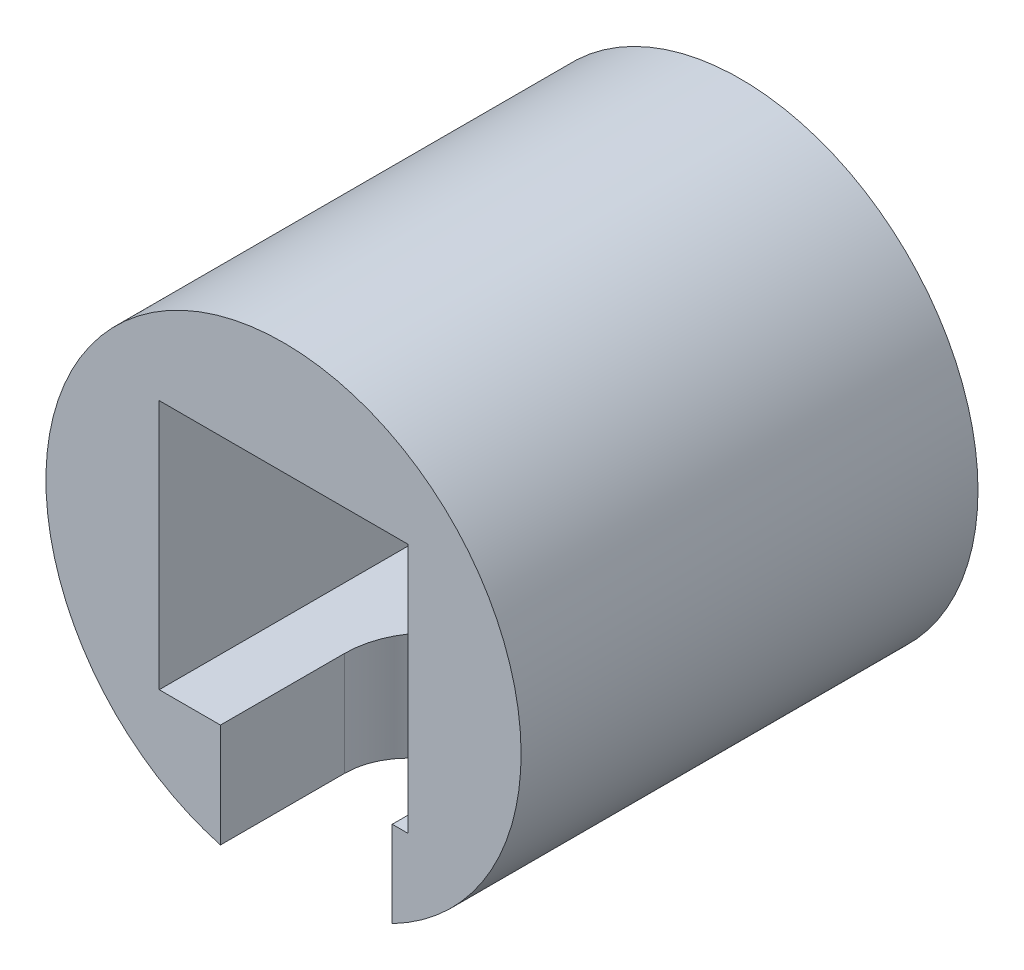
ISO-10303-21;
HEADER;
FILE_DESCRIPTION(('STEP AP214'),'2;1');
FILE_NAME('part.step','',(''),(''),'','','');
FILE_SCHEMA(('AUTOMOTIVE_DESIGN { 1 0 10303 214 1 1 1 1 }'));
ENDSEC;
DATA;
#1=APPLICATION_CONTEXT('core data for automotive mechanical design processes');
#2=APPLICATION_PROTOCOL_DEFINITION('international standard','automotive_design',2000,#1);
#3=PRODUCT_CONTEXT('',#1,'mechanical');
#4=PRODUCT('Part','Part','',(#3));
#5=PRODUCT_RELATED_PRODUCT_CATEGORY('part','',(#4));
#6=PRODUCT_DEFINITION_FORMATION('','',#4);
#7=PRODUCT_DEFINITION_CONTEXT('part definition',#1,'design');
#8=PRODUCT_DEFINITION('design','',#6,#7);
#9=PRODUCT_DEFINITION_SHAPE('','',#8);
#10=(LENGTH_UNIT() NAMED_UNIT(*) SI_UNIT(.MILLI.,.METRE.));
#11=(NAMED_UNIT(*) PLANE_ANGLE_UNIT() SI_UNIT($,.RADIAN.));
#12=(NAMED_UNIT(*) SI_UNIT($,.STERADIAN.) SOLID_ANGLE_UNIT());
#13=UNCERTAINTY_MEASURE_WITH_UNIT(LENGTH_MEASURE(1.E-05),#10,'distance_accuracy_value','');
#14=(GEOMETRIC_REPRESENTATION_CONTEXT(3) GLOBAL_UNCERTAINTY_ASSIGNED_CONTEXT((#13)) GLOBAL_UNIT_ASSIGNED_CONTEXT((#10,
#11,#12)) REPRESENTATION_CONTEXT('',''));
#15=CARTESIAN_POINT('',(0.,0.,0.));
#16=DIRECTION('',(0.,0.,1.));
#17=DIRECTION('',(1.,0.,0.));
#18=AXIS2_PLACEMENT_3D('',#15,#16,#17);
#19=CARTESIAN_POINT('',(0.,0.,25.));
#20=DIRECTION('',(0.,0.,1.));
#21=DIRECTION('',(1.,0.,0.));
#22=AXIS2_PLACEMENT_3D('',#19,#20,#21);
#23=PLANE('',#22);
#24=DIRECTION('',(0.,1.,0.));
#25=VECTOR('',#24,1.);
#26=CARTESIAN_POINT('',(5.94999999999998,-13.001,25.));
#27=LINE('',#26,#25);
#28=CARTESIAN_POINT('',(5.94999999999998,-11.5584384758496,25.));
#29=VERTEX_POINT('',#28);
#30=CARTESIAN_POINT('',(5.94999999999998,-6.85,25.));
#31=VERTEX_POINT('',#30);
#32=EDGE_CURVE('E116',#29,#31,#27,.T.);
#33=ORIENTED_EDGE('',*,*,#32,.F.);
#34=CARTESIAN_POINT('',(0.,0.,25.));
#35=DIRECTION('',(0.,0.,1.));
#36=DIRECTION('',(1.,0.,0.));
#37=AXIS2_PLACEMENT_3D('',#34,#35,#36);
#38=CIRCLE('',#37,13.);
#39=CARTESIAN_POINT('',(-3.45000000000002,-12.5338541558453,25.));
#40=VERTEX_POINT('',#39);
#41=EDGE_CURVE('E122',#29,#40,#38,.T.);
#42=ORIENTED_EDGE('',*,*,#41,.T.);
#43=DIRECTION('',(0.,1.,0.));
#44=VECTOR('',#43,1.);
#45=CARTESIAN_POINT('',(-3.45000000000002,-13.001,25.));
#46=LINE('',#45,#44);
#47=CARTESIAN_POINT('',(-3.45000000000002,-6.85,25.));
#48=VERTEX_POINT('',#47);
#49=EDGE_CURVE('E103',#40,#48,#46,.T.);
#50=ORIENTED_EDGE('',*,*,#49,.T.);
#51=DIRECTION('',(1.,0.,0.));
#52=VECTOR('',#51,1.);
#53=CARTESIAN_POINT('',(-6.8,-6.85,25.));
#54=LINE('',#53,#52);
#55=CARTESIAN_POINT('',(-6.8,-6.85,25.));
#56=VERTEX_POINT('',#55);
#57=EDGE_CURVE('E204',#56,#48,#54,.T.);
#58=ORIENTED_EDGE('',*,*,#57,.F.);
#59=DIRECTION('',(0.,1.,0.));
#60=VECTOR('',#59,1.);
#61=CARTESIAN_POINT('',(-6.8,-6.85,25.));
#62=LINE('',#61,#60);
#63=CARTESIAN_POINT('',(-6.8,6.85,25.));
#64=VERTEX_POINT('',#63);
#65=EDGE_CURVE('E230',#56,#64,#62,.T.);
#66=ORIENTED_EDGE('',*,*,#65,.T.);
#67=DIRECTION('',(1.,0.,0.));
#68=VECTOR('',#67,1.);
#69=CARTESIAN_POINT('',(-6.8,6.85,25.));
#70=LINE('',#69,#68);
#71=CARTESIAN_POINT('',(6.8,6.85,25.));
#72=VERTEX_POINT('',#71);
#73=EDGE_CURVE('E219',#64,#72,#70,.T.);
#74=ORIENTED_EDGE('',*,*,#73,.T.);
#75=DIRECTION('',(0.,1.,0.));
#76=VECTOR('',#75,1.);
#77=CARTESIAN_POINT('',(6.8,-6.85,25.));
#78=LINE('',#77,#76);
#79=CARTESIAN_POINT('',(6.8,-6.85,25.));
#80=VERTEX_POINT('',#79);
#81=EDGE_CURVE('E227',#80,#72,#78,.T.);
#82=ORIENTED_EDGE('',*,*,#81,.F.);
#83=EDGE_CURVE('E203',#31,#80,#54,.T.);
#84=ORIENTED_EDGE('',*,*,#83,.F.);
#85=EDGE_LOOP('',(#33,#42,#50,#58,#66,#74,#82,#84));
#86=FACE_BOUND('',#85,.T.);
#87=ADVANCED_FACE('F39',(#86),#23,.T.);
#88=CARTESIAN_POINT('',(0.,0.,0.));
#89=DIRECTION('',(0.,0.,1.));
#90=DIRECTION('',(1.,0.,0.));
#91=AXIS2_PLACEMENT_3D('',#88,#89,#90);
#92=PLANE('',#91);
#93=CARTESIAN_POINT('',(0.,0.,0.));
#94=DIRECTION('',(0.,0.,1.));
#95=DIRECTION('',(1.,0.,0.));
#96=AXIS2_PLACEMENT_3D('',#93,#94,#95);
#97=CIRCLE('',#96,13.);
#98=CARTESIAN_POINT('',(13.,0.,0.));
#99=VERTEX_POINT('',#98);
#100=EDGE_CURVE('E131',#99,#99,#97,.T.);
#101=ORIENTED_EDGE('',*,*,#100,.F.);
#102=EDGE_LOOP('',(#101));
#103=FACE_BOUND('',#102,.T.);
#104=CARTESIAN_POINT('',(0.,0.,0.));
#105=DIRECTION('',(0.,0.,1.));
#106=DIRECTION('',(1.,0.,0.));
#107=AXIS2_PLACEMENT_3D('',#104,#105,#106);
#108=CIRCLE('',#107,3.);
#109=CARTESIAN_POINT('',(3.,0.,0.));
#110=VERTEX_POINT('',#109);
#111=EDGE_CURVE('E137',#110,#110,#108,.T.);
#112=ORIENTED_EDGE('',*,*,#111,.T.);
#113=EDGE_LOOP('',(#112));
#114=FACE_BOUND('',#113,.T.);
#115=ADVANCED_FACE('F253',(#103,#114),#92,.F.);
#116=CARTESIAN_POINT('',(0.,0.,25.));
#117=DIRECTION('',(0.,0.,-1.));
#118=DIRECTION('',(-1.,0.,0.));
#119=AXIS2_PLACEMENT_3D('',#116,#117,#118);
#120=CYLINDRICAL_SURFACE('',#119,13.);
#121=ORIENTED_EDGE('',*,*,#41,.F.);
#122=DIRECTION('',(0.,0.,-1.));
#123=VECTOR('',#122,1.);
#124=CARTESIAN_POINT('',(5.94999999999998,-11.5584384758496,25.));
#125=LINE('',#124,#123);
#126=CARTESIAN_POINT('',(5.94999999999998,-11.5584384758496,18.2));
#127=VERTEX_POINT('',#126);
#128=EDGE_CURVE('E126',#127,#29,#125,.F.);
#129=ORIENTED_EDGE('',*,*,#128,.F.);
#130=CARTESIAN_POINT('',(-3.45000000000002,-12.5338541558453,18.2));
#131=CARTESIAN_POINT('',(-3.45001670615479,-12.5338338699505,18.0700170037956));
#132=CARTESIAN_POINT('',(-3.44460850980669,-12.5353377346853,17.9400405965567));
#133=CARTESIAN_POINT('',(-3.4230664656206,-12.5412457738844,17.6810720091781));
#134=CARTESIAN_POINT('',(-3.40693483046943,-12.545649350017,17.5520796315454));
#135=CARTESIAN_POINT('',(-3.36411761846852,-12.5571960836915,17.2962804223832));
#136=CARTESIAN_POINT('',(-3.33745558579157,-12.5643331285927,17.1694693693686));
#137=CARTESIAN_POINT('',(-3.27380824797861,-12.5810678531316,16.9186328492664));
#138=CARTESIAN_POINT('',(-3.23682270562729,-12.5906655893112,16.7946074462587));
#139=CARTESIAN_POINT('',(-3.1528371366532,-12.6119582245659,16.5502415102941));
#140=CARTESIAN_POINT('',(-3.10584191969098,-12.6236521160099,16.4298992392375));
#141=CARTESIAN_POINT('',(-3.00218696659942,-12.6487039894841,16.1936157930467));
#142=CARTESIAN_POINT('',(-2.94552363266405,-12.6620625905036,16.0776762760211));
#143=CARTESIAN_POINT('',(-2.7615953407736,-12.7039141566534,15.7376021507025));
#144=CARTESIAN_POINT('',(-2.62033708002066,-12.7341978022548,15.5210526328669));
#145=CARTESIAN_POINT('',(-2.30073058255372,-12.7958453513994,15.1093898013899));
#146=CARTESIAN_POINT('',(-2.12159837981606,-12.827218022269,14.9148898575811));
#147=CARTESIAN_POINT('',(-1.73284399105452,-12.8854884477607,14.5582737685562));
#148=CARTESIAN_POINT('',(-1.5232200196489,-12.9123859401504,14.396159520937));
#149=CARTESIAN_POINT('',(-1.0782948863859,-12.9571351263544,14.1086174752519));
#150=CARTESIAN_POINT('',(-0.842915867446498,-12.9749584167979,13.9833053841436));
#151=CARTESIAN_POINT('',(-0.353848638451138,-12.9974838030029,13.7741294737574));
#152=CARTESIAN_POINT('',(-0.100167520089713,-13.0021909532883,13.6902496980995));
#153=CARTESIAN_POINT('',(0.406754412578795,-12.9960035958238,13.5692328159627));
#154=CARTESIAN_POINT('',(0.65957419416831,-12.9857502204706,13.530295721364));
#155=CARTESIAN_POINT('',(1.167087173587,-12.950003253365,13.4938515126059));
#156=CARTESIAN_POINT('',(1.42178017745422,-12.9245112181468,13.4963401677611));
#157=CARTESIAN_POINT('',(1.92035033902768,-12.8597899820306,13.5414570065457));
#158=CARTESIAN_POINT('',(2.16434221917391,-12.8208544720661,13.5832575659048));
#159=CARTESIAN_POINT('',(2.64075111215984,-12.7312702556039,13.7037547380677));
#160=CARTESIAN_POINT('',(2.87316616784583,-12.6806195766774,13.7824575662302));
#161=CARTESIAN_POINT('',(3.33095171988462,-12.5683214433434,13.9781198101171));
#162=CARTESIAN_POINT('',(3.55558240907032,-12.5062930303278,14.0965870483949));
#163=CARTESIAN_POINT('',(3.9819639006405,-12.3771431412416,14.3672219753027));
#164=CARTESIAN_POINT('',(4.18370449133996,-12.3100194141728,14.5194046162898));
#165=CARTESIAN_POINT('',(4.57303472396265,-12.1709875785675,14.8653611691466));
#166=CARTESIAN_POINT('',(4.75873622763323,-12.0990637848864,15.0612560835122));
#167=CARTESIAN_POINT('',(5.09494113092112,-11.9613818172088,15.483538606956));
#168=CARTESIAN_POINT('',(5.24543115645621,-11.8956259916029,15.7099377509179));
#169=CARTESIAN_POINT('',(5.44107702365834,-11.8067708898621,16.068443121309));
#170=CARTESIAN_POINT('',(5.50134662743269,-11.7787468818034,16.191298907954));
#171=CARTESIAN_POINT('',(5.61119258345697,-11.7268157001097,16.4425135806797));
#172=CARTESIAN_POINT('',(5.66077427295021,-11.7029064728773,16.5708696814888));
#173=CARTESIAN_POINT('',(5.74859681525356,-11.6600182446042,16.8319471662664));
#174=CARTESIAN_POINT('',(5.78685732003409,-11.6410307073995,16.964660536284));
#175=CARTESIAN_POINT('',(5.85163318131178,-11.6086045341393,17.2335239922577));
#176=CARTESIAN_POINT('',(5.87815542332744,-11.5951626453903,17.3696720138122));
#177=CARTESIAN_POINT('',(5.91569102593465,-11.5760521263253,17.6214455297379));
#178=CARTESIAN_POINT('',(5.92854691318283,-11.5694640834196,17.7367301148368));
#179=CARTESIAN_POINT('',(5.94570533204273,-11.5606490537441,17.9680038979946));
#180=CARTESIAN_POINT('',(5.95001480430561,-11.5584185282017,18.0839924474981));
#181=CARTESIAN_POINT('',(5.94999999999998,-11.5584384758496,18.2));
#182=B_SPLINE_CURVE_WITH_KNOTS('',3,(#130,#131,#132,#133,#134,#135,#136,#137,#138,#139,#140,
#141,#142,#143,#144,#145,#146,#147,#148,#149,#150,#151,#152,#153,#154,#155,#156,#157,#158,#159,
#160,#161,#162,#163,#164,#165,#166,#167,#168,#169,#170,#171,#172,#173,#174,#175,#176,#177,#178,
#179,#180,#181),.UNSPECIFIED.,.F.,.F.,(4,2,2,2,2,2,2,2,2,2,2,2,2,2,2,2,2,2,2,2,2,2,2,2,2,4),(0.,
0.389817590797354,0.779554771138028,1.16842545414183,1.55730507341598,1.94599825541877,
2.33483639893961,3.11201116056941,3.90720389182424,4.70244320268249,5.50015663846308,
6.29756261949358,7.06178343502725,7.82592620350302,8.5743334434166,9.32286678103206,
10.1037847466781,10.8850497353739,11.7193096089318,12.55388583994,12.9724590807699,
13.3908228111871,13.808456002852,14.2258438903528,14.5740138819256,14.92190100429),.UNSPECIFIED.);
#183=CARTESIAN_POINT('',(-3.45000000000002,-12.5338541558453,18.2));
#184=VERTEX_POINT('',#183);
#185=EDGE_CURVE('E115',#184,#127,#182,.T.);
#186=ORIENTED_EDGE('',*,*,#185,.F.);
#187=DIRECTION('',(0.,0.,-1.));
#188=VECTOR('',#187,1.);
#189=CARTESIAN_POINT('',(-3.45000000000002,-12.5338541558453,25.));
#190=LINE('',#189,#188);
#191=EDGE_CURVE('E106',#40,#184,#190,.T.);
#192=ORIENTED_EDGE('',*,*,#191,.F.);
#193=EDGE_LOOP('',(#121,#129,#186,#192));
#194=FACE_BOUND('',#193,.T.);
#195=ORIENTED_EDGE('',*,*,#100,.T.);
#196=EDGE_LOOP('',(#195));
#197=FACE_BOUND('',#196,.T.);
#198=ADVANCED_FACE('F41',(#194,#197),#120,.T.);
#199=CARTESIAN_POINT('',(0.,0.,25.));
#200=DIRECTION('',(0.,0.,-1.));
#201=DIRECTION('',(-1.,0.,0.));
#202=AXIS2_PLACEMENT_3D('',#199,#200,#201);
#203=CYLINDRICAL_SURFACE('',#202,3.);
#204=CARTESIAN_POINT('',(-3.,0.,6.02020115108626));
#205=CARTESIAN_POINT('',(-2.99999446741164,0.162957974535711,6.02019715889915));
#206=CARTESIAN_POINT('',(-2.98667043948869,0.325976616486676,6.01552486733287));
#207=CARTESIAN_POINT('',(-2.93386950211209,0.647268905962726,5.9972959794923));
#208=CARTESIAN_POINT('',(-2.89437445101225,0.80553918233337,5.98373322045261));
#209=CARTESIAN_POINT('',(-2.7907749715707,1.11255261299333,5.94907795376499));
#210=CARTESIAN_POINT('',(-2.72671880080957,1.26131378620155,5.92800021717272));
#211=CARTESIAN_POINT('',(-2.57606068887559,1.54591432815751,5.88019968130932));
#212=CARTESIAN_POINT('',(-2.48945705268559,1.68175272438024,5.85347645766433));
#213=CARTESIAN_POINT('',(-2.29297086498378,1.94156207428369,5.79563966773013));
#214=CARTESIAN_POINT('',(-2.18242432628628,2.06500514866599,5.7644118075015));
#215=CARTESIAN_POINT('',(-1.94274625286289,2.29193961776464,5.70073076775229));
#216=CARTESIAN_POINT('',(-1.81361068789591,2.39542667445299,5.66827732364432));
#217=CARTESIAN_POINT('',(-1.53469129151707,2.58341979672403,5.60330470625798));
#218=CARTESIAN_POINT('',(-1.38431029665359,2.66705762100901,5.57082967720915));
#219=CARTESIAN_POINT('',(-1.07084895881828,2.80762894822275,5.5094863445493));
#220=CARTESIAN_POINT('',(-0.907769162064395,2.86456359900529,5.48061788594657));
#221=CARTESIAN_POINT('',(-0.574965175426494,2.94934228136418,5.42864203030774));
#222=CARTESIAN_POINT('',(-0.405316921325506,2.97745204193074,5.40548353163724));
#223=CARTESIAN_POINT('',(-0.062950062384024,3.00424721830599,5.36583349155712));
#224=CARTESIAN_POINT('',(0.109767836010648,3.00293931885521,5.34934043638835));
#225=CARTESIAN_POINT('',(0.447202845307816,2.97115611358553,5.32392894563675));
#226=CARTESIAN_POINT('',(0.611994626375817,2.94165545528972,5.31477613867057));
#227=CARTESIAN_POINT('',(0.934586813819917,2.85559267201887,5.30284629342992));
#228=CARTESIAN_POINT('',(1.09238769139461,2.7990323739501,5.30006882480384));
#229=CARTESIAN_POINT('',(1.3943782622204,2.66137051028111,5.29993451041946));
#230=CARTESIAN_POINT('',(1.53871895859368,2.58059952901042,5.30250725704006));
#231=CARTESIAN_POINT('',(1.81211194817555,2.39654144095429,5.31152588533787));
#232=CARTESIAN_POINT('',(1.9411630637649,2.29325260155809,5.31797206511903));
#233=CARTESIAN_POINT('',(2.18212135463875,2.06547777076252,5.33314541418414));
#234=CARTESIAN_POINT('',(2.2937759925803,1.94072660962631,5.34190195401029));
#235=CARTESIAN_POINT('',(2.4948174123356,1.67443219779662,5.35980354524834));
#236=CARTESIAN_POINT('',(2.58420266192689,1.53288779264973,5.36894862334257));
#237=CARTESIAN_POINT('',(2.73918305109001,1.23506604652286,5.38600322546301));
#238=CARTESIAN_POINT('',(2.80447940678513,1.07863210433967,5.39389658176337));
#239=CARTESIAN_POINT('',(2.90785787807978,0.75690671144176,5.40686731213631));
#240=CARTESIAN_POINT('',(2.94594133845936,0.591615698851004,5.41194482535667));
#241=CARTESIAN_POINT('',(2.99363345915491,0.257767597408392,5.41835973009172));
#242=CARTESIAN_POINT('',(3.00338715367084,0.0892316065340372,5.4197161696473));
#243=CARTESIAN_POINT('',(2.99453626121639,-0.247075545948535,5.4185051000292));
#244=CARTESIAN_POINT('',(2.97593251012333,-0.414846729954353,5.41593770651625));
#245=CARTESIAN_POINT('',(2.9111266933688,-0.743831350209529,5.40735745895802));
#246=CARTESIAN_POINT('',(2.86508940889435,-0.905077851206404,5.40136518537412));
#247=CARTESIAN_POINT('',(2.74689002628325,-1.21758246537772,5.38700495577145));
#248=CARTESIAN_POINT('',(2.6747263065347,-1.3688399578666,5.37863685229698));
#249=CARTESIAN_POINT('',(2.50571210282466,-1.65821458532161,5.36098026109575));
#250=CARTESIAN_POINT('',(2.40869522646901,-1.79623417853323,5.35168583847235));
#251=CARTESIAN_POINT('',(2.19289562904154,-2.05413743970264,5.33405127322536));
#252=CARTESIAN_POINT('',(2.07411216282532,-2.17402048652819,5.32571116328701));
#253=CARTESIAN_POINT('',(1.81753318112658,-2.39271762015452,5.31184867214265));
#254=CARTESIAN_POINT('',(1.67966388689599,-2.4914459628004,5.30633763638957));
#255=CARTESIAN_POINT('',(1.38920085697665,-2.6643342095391,5.29993458095722));
#256=CARTESIAN_POINT('',(1.23660879319475,-2.7384968990591,5.29904203743276));
#257=CARTESIAN_POINT('',(0.923301399600446,-2.85925202955359,5.30319945738309));
#258=CARTESIAN_POINT('',(0.762722198102673,-2.90620033776024,5.30817001108797));
#259=CARTESIAN_POINT('',(0.436331947935936,-2.97276803736004,5.32465047908244));
#260=CARTESIAN_POINT('',(0.270521373632732,-2.99238989939434,5.33615980205573));
#261=CARTESIAN_POINT('',(-0.0595179205181034,-3.00389904868057,5.36558153313864));
#262=CARTESIAN_POINT('',(-0.223742511643912,-2.99610741437583,5.3834176282206));
#263=CARTESIAN_POINT('',(-0.548007485265154,-2.95405241070431,5.42487176149058));
#264=CARTESIAN_POINT('',(-0.708047524526861,-2.91978687684032,5.44849027233912));
#265=CARTESIAN_POINT('',(-1.02225875508367,-2.82530207087734,5.50068428826313));
#266=CARTESIAN_POINT('',(-1.17629579991255,-2.7646779532568,5.52933278125698));
#267=CARTESIAN_POINT('',(-1.47190675412557,-2.61928185696986,5.58952779666857));
#268=CARTESIAN_POINT('',(-1.61347817392463,-2.53450506888304,5.62107489542511));
#269=CARTESIAN_POINT('',(-1.88519877302039,-2.33984507462566,5.68597994655324));
#270=CARTESIAN_POINT('',(-2.01481163841062,-2.22922079828333,5.71936323240304));
#271=CARTESIAN_POINT('',(-2.25373786064477,-1.98735188283359,5.78431700544838));
#272=CARTESIAN_POINT('',(-2.36304598677435,-1.85610194636957,5.8158870240843));
#273=CARTESIAN_POINT('',(-2.55900551554928,-1.57513848365388,5.87473919594396));
#274=CARTESIAN_POINT('',(-2.64546784042261,-1.42528509357787,5.90198486309016));
#275=CARTESIAN_POINT('',(-2.79160663134581,-1.11207993986719,5.94923006079185));
#276=CARTESIAN_POINT('',(-2.85131164349846,-0.948742782864131,5.96923730925724));
#277=CARTESIAN_POINT('',(-2.9307387656384,-0.654270595616545,5.99620126307075));
#278=CARTESIAN_POINT('',(-2.95665083926917,-0.524953794616178,6.00514773306333));
#279=CARTESIAN_POINT('',(-2.99128267848224,-0.263771043180912,6.01714894423247));
#280=CARTESIAN_POINT('',(-3.00000447832186,-0.131905396235735,6.02020438253918));
#281=CARTESIAN_POINT('',(-3.,0.,6.02020115108626));
#282=B_SPLINE_CURVE_WITH_KNOTS('',3,(#204,#205,#206,#207,#208,#209,#210,#211,#212,#213,#214,
#215,#216,#217,#218,#219,#220,#221,#222,#223,#224,#225,#226,#227,#228,#229,#230,#231,#232,#233,
#234,#235,#236,#237,#238,#239,#240,#241,#242,#243,#244,#245,#246,#247,#248,#249,#250,#251,#252,
#253,#254,#255,#256,#257,#258,#259,#260,#261,#262,#263,#264,#265,#266,#267,#268,#269,#270,#271,
#272,#273,#274,#275,#276,#277,#278,#279,#280,#281),.UNSPECIFIED.,.T.,.F.,(4,2,2,2,2,2,2,2,2,2,2,
2,2,2,2,2,2,2,2,2,2,2,2,2,2,2,2,2,2,2,2,2,2,2,2,2,2,2,4),(0.,0.488380314552806,
0.977099526991593,1.46486338618461,1.95266392386612,2.45628751832784,2.96002046709861,
3.48284887346649,4.00565480364516,4.52359657759069,5.04142065789979,5.54196716560478,
6.04247988414852,6.5364476688094,7.03045347467782,7.53107023239489,8.03172142502861,
8.53838875299427,9.04503104124143,9.5490749632715,10.0531040281547,10.5541357036643,
11.05519848247,11.5597077967219,12.064234385271,12.5707687765568,13.077245713721,
13.576940956599,14.0765910180515,14.5704085469952,15.0642664545688,15.56599346253,
16.0678204472078,16.5863333803923,17.1049797032769,17.62779279557,18.1500467879046,
18.5454102168039,18.9407268564981),.UNSPECIFIED.);
#283=CARTESIAN_POINT('',(-3.,0.,6.02020115108626));
#284=VERTEX_POINT('',#283);
#285=EDGE_CURVE('E142',#284,#284,#282,.T.);
#286=ORIENTED_EDGE('',*,*,#285,.F.);
#287=EDGE_LOOP('',(#286));
#288=FACE_BOUND('',#287,.T.);
#289=ORIENTED_EDGE('',*,*,#111,.F.);
#290=EDGE_LOOP('',(#289));
#291=FACE_BOUND('',#290,.T.);
#292=ADVANCED_FACE('F151',(#288,#291),#203,.F.);
#293=CARTESIAN_POINT('',(1.24999999999998,-6.85,18.2));
#294=DIRECTION('',(0.,1.,0.));
#295=DIRECTION('',(0.,0.,1.));
#296=AXIS2_PLACEMENT_3D('',#293,#294,#295);
#297=CYLINDRICAL_SURFACE('',#296,12.9);
#298=ORIENTED_EDGE('',*,*,#285,.T.);
#299=EDGE_LOOP('',(#298));
#300=FACE_BOUND('',#299,.T.);
#301=CARTESIAN_POINT('',(1.24999999999998,6.85,18.2));
#302=DIRECTION('',(0.,1.,0.));
#303=DIRECTION('',(0.,0.,1.));
#304=AXIS2_PLACEMENT_3D('',#301,#302,#303);
#305=CIRCLE('',#304,12.9);
#306=CARTESIAN_POINT('',(6.8,6.85,6.55493666827012));
#307=VERTEX_POINT('',#306);
#308=CARTESIAN_POINT('',(-6.8,6.85,8.11994543665559));
#309=VERTEX_POINT('',#308);
#310=EDGE_CURVE('E125',#307,#309,#305,.T.);
#311=ORIENTED_EDGE('',*,*,#310,.T.);
#312=DIRECTION('',(0.,1.,0.));
#313=VECTOR('',#312,1.);
#314=CARTESIAN_POINT('',(-6.8,-6.85,8.11994543665559));
#315=LINE('',#314,#313);
#316=CARTESIAN_POINT('',(-6.8,-6.85,8.11994543665559));
#317=VERTEX_POINT('',#316);
#318=EDGE_CURVE('E211',#317,#309,#315,.T.);
#319=ORIENTED_EDGE('',*,*,#318,.F.);
#320=CARTESIAN_POINT('',(1.24999999999998,-6.85,18.2));
#321=DIRECTION('',(0.,1.,0.));
#322=DIRECTION('',(0.,0.,1.));
#323=AXIS2_PLACEMENT_3D('',#320,#321,#322);
#324=CIRCLE('',#323,12.9);
#325=CARTESIAN_POINT('',(6.8,-6.85,6.55493666827012));
#326=VERTEX_POINT('',#325);
#327=EDGE_CURVE('E195',#326,#317,#324,.T.);
#328=ORIENTED_EDGE('',*,*,#327,.F.);
#329=DIRECTION('',(0.,1.,0.));
#330=VECTOR('',#329,1.);
#331=CARTESIAN_POINT('',(6.8,-6.85,6.55493666827012));
#332=LINE('',#331,#330);
#333=EDGE_CURVE('E150',#326,#307,#332,.T.);
#334=ORIENTED_EDGE('',*,*,#333,.T.);
#335=EDGE_LOOP('',(#311,#319,#328,#334));
#336=FACE_BOUND('',#335,.T.);
#337=ADVANCED_FACE('F154',(#300,#336),#297,.F.);
#338=CARTESIAN_POINT('',(6.8,-6.85,25.));
#339=DIRECTION('',(1.,0.,0.));
#340=DIRECTION('',(0.,0.,-1.));
#341=AXIS2_PLACEMENT_3D('',#338,#339,#340);
#342=PLANE('',#341);
#343=DIRECTION('',(0.,0.,-1.));
#344=VECTOR('',#343,1.);
#345=CARTESIAN_POINT('',(6.8,6.85,25.));
#346=LINE('',#345,#344);
#347=EDGE_CURVE('E63',#72,#307,#346,.T.);
#348=ORIENTED_EDGE('',*,*,#347,.T.);
#349=ORIENTED_EDGE('',*,*,#333,.F.);
#350=DIRECTION('',(0.,0.,-1.));
#351=VECTOR('',#350,1.);
#352=CARTESIAN_POINT('',(6.8,-6.85,25.));
#353=LINE('',#352,#351);
#354=EDGE_CURVE('E207',#80,#326,#353,.T.);
#355=ORIENTED_EDGE('',*,*,#354,.F.);
#356=ORIENTED_EDGE('',*,*,#81,.T.);
#357=EDGE_LOOP('',(#348,#349,#355,#356));
#358=FACE_BOUND('',#357,.T.);
#359=ADVANCED_FACE('F158',(#358),#342,.F.);
#360=CARTESIAN_POINT('',(-6.8,-6.85,25.));
#361=DIRECTION('',(-1.,0.,0.));
#362=DIRECTION('',(0.,0.,1.));
#363=AXIS2_PLACEMENT_3D('',#360,#361,#362);
#364=PLANE('',#363);
#365=DIRECTION('',(0.,0.,1.));
#366=VECTOR('',#365,1.);
#367=CARTESIAN_POINT('',(-6.8,6.85,25.));
#368=LINE('',#367,#366);
#369=EDGE_CURVE('E215',#309,#64,#368,.T.);
#370=ORIENTED_EDGE('',*,*,#369,.T.);
#371=ORIENTED_EDGE('',*,*,#65,.F.);
#372=DIRECTION('',(0.,0.,1.));
#373=VECTOR('',#372,1.);
#374=CARTESIAN_POINT('',(-6.8,-6.85,25.));
#375=LINE('',#374,#373);
#376=EDGE_CURVE('E199',#317,#56,#375,.T.);
#377=ORIENTED_EDGE('',*,*,#376,.F.);
#378=ORIENTED_EDGE('',*,*,#318,.T.);
#379=EDGE_LOOP('',(#370,#371,#377,#378));
#380=FACE_BOUND('',#379,.T.);
#381=ADVANCED_FACE('F160',(#380),#364,.F.);
#382=CARTESIAN_POINT('',(1.24999999999998,-6.85,18.2));
#383=DIRECTION('',(0.,1.,0.));
#384=DIRECTION('',(0.,0.,1.));
#385=AXIS2_PLACEMENT_3D('',#382,#383,#384);
#386=PLANE('',#385);
#387=DIRECTION('',(0.,0.,-1.));
#388=VECTOR('',#387,1.);
#389=CARTESIAN_POINT('',(5.94999999999998,-6.85,18.2));
#390=LINE('',#389,#388);
#391=CARTESIAN_POINT('',(5.94999999999998,-6.85,18.2));
#392=VERTEX_POINT('',#391);
#393=EDGE_CURVE('E11',#31,#392,#390,.T.);
#394=ORIENTED_EDGE('',*,*,#393,.F.);
#395=ORIENTED_EDGE('',*,*,#83,.T.);
#396=ORIENTED_EDGE('',*,*,#354,.T.);
#397=ORIENTED_EDGE('',*,*,#327,.T.);
#398=ORIENTED_EDGE('',*,*,#376,.T.);
#399=ORIENTED_EDGE('',*,*,#57,.T.);
#400=DIRECTION('',(0.,0.,1.));
#401=VECTOR('',#400,1.);
#402=CARTESIAN_POINT('',(-3.45000000000002,-6.85,18.2));
#403=LINE('',#402,#401);
#404=CARTESIAN_POINT('',(-3.45000000000002,-6.85,18.2));
#405=VERTEX_POINT('',#404);
#406=EDGE_CURVE('E109',#405,#48,#403,.T.);
#407=ORIENTED_EDGE('',*,*,#406,.F.);
#408=CARTESIAN_POINT('',(1.24999999999998,-6.85,18.2));
#409=DIRECTION('',(0.,1.,0.));
#410=DIRECTION('',(0.,0.,1.));
#411=AXIS2_PLACEMENT_3D('',#408,#409,#410);
#412=CIRCLE('',#411,4.7);
#413=EDGE_CURVE('E48',#392,#405,#412,.T.);
#414=ORIENTED_EDGE('',*,*,#413,.F.);
#415=EDGE_LOOP('',(#394,#395,#396,#397,#398,#399,#407,#414));
#416=FACE_BOUND('',#415,.T.);
#417=ADVANCED_FACE('F163',(#416),#386,.T.);
#418=CARTESIAN_POINT('',(1.24999999999998,6.85,18.2));
#419=DIRECTION('',(0.,1.,0.));
#420=DIRECTION('',(0.,0.,1.));
#421=AXIS2_PLACEMENT_3D('',#418,#419,#420);
#422=PLANE('',#421);
#423=ORIENTED_EDGE('',*,*,#310,.F.);
#424=ORIENTED_EDGE('',*,*,#347,.F.);
#425=ORIENTED_EDGE('',*,*,#73,.F.);
#426=ORIENTED_EDGE('',*,*,#369,.F.);
#427=EDGE_LOOP('',(#423,#424,#425,#426));
#428=FACE_BOUND('',#427,.T.);
#429=ADVANCED_FACE('F168',(#428),#422,.F.);
#430=CARTESIAN_POINT('',(1.24999999999998,-13.001,18.2));
#431=DIRECTION('',(0.,1.,0.));
#432=DIRECTION('',(0.,0.,1.));
#433=AXIS2_PLACEMENT_3D('',#430,#431,#432);
#434=CYLINDRICAL_SURFACE('',#433,4.7);
#435=ORIENTED_EDGE('',*,*,#413,.T.);
#436=DIRECTION('',(0.,1.,0.));
#437=VECTOR('',#436,1.);
#438=CARTESIAN_POINT('',(-3.45000000000002,-13.001,18.2));
#439=LINE('',#438,#437);
#440=EDGE_CURVE('E55',#184,#405,#439,.T.);
#441=ORIENTED_EDGE('',*,*,#440,.F.);
#442=ORIENTED_EDGE('',*,*,#185,.T.);
#443=DIRECTION('',(0.,1.,0.));
#444=VECTOR('',#443,1.);
#445=CARTESIAN_POINT('',(5.94999999999998,-13.001,18.2));
#446=LINE('',#445,#444);
#447=EDGE_CURVE('E187',#127,#392,#446,.T.);
#448=ORIENTED_EDGE('',*,*,#447,.T.);
#449=EDGE_LOOP('',(#435,#441,#442,#448));
#450=FACE_BOUND('',#449,.T.);
#451=ADVANCED_FACE('F171',(#450),#434,.F.);
#452=CARTESIAN_POINT('',(5.94999999999998,-13.001,18.2));
#453=DIRECTION('',(1.,0.,0.));
#454=DIRECTION('',(0.,0.,-1.));
#455=AXIS2_PLACEMENT_3D('',#452,#453,#454);
#456=PLANE('',#455);
#457=ORIENTED_EDGE('',*,*,#393,.T.);
#458=ORIENTED_EDGE('',*,*,#447,.F.);
#459=ORIENTED_EDGE('',*,*,#128,.T.);
#460=ORIENTED_EDGE('',*,*,#32,.T.);
#461=EDGE_LOOP('',(#457,#458,#459,#460));
#462=FACE_BOUND('',#461,.T.);
#463=ADVANCED_FACE('F245',(#462),#456,.F.);
#464=CARTESIAN_POINT('',(-3.45000000000002,-13.001,18.2));
#465=DIRECTION('',(-1.,0.,0.));
#466=DIRECTION('',(0.,0.,1.));
#467=AXIS2_PLACEMENT_3D('',#464,#465,#466);
#468=PLANE('',#467);
#469=ORIENTED_EDGE('',*,*,#406,.T.);
#470=ORIENTED_EDGE('',*,*,#49,.F.);
#471=ORIENTED_EDGE('',*,*,#191,.T.);
#472=ORIENTED_EDGE('',*,*,#440,.T.);
#473=EDGE_LOOP('',(#469,#470,#471,#472));
#474=FACE_BOUND('',#473,.T.);
#475=ADVANCED_FACE('F105',(#474),#468,.F.);
#476=CLOSED_SHELL('',(#87,#115,#198,#292,#337,#359,#381,#417,#429,#451,#463,#475));
#477=MANIFOLD_SOLID_BREP('B2',#476);
#478=ADVANCED_BREP_SHAPE_REPRESENTATION('',(#18,#477),#14);
#479=SHAPE_DEFINITION_REPRESENTATION(#9,#478);
ENDSEC;
END-ISO-10303-21;
